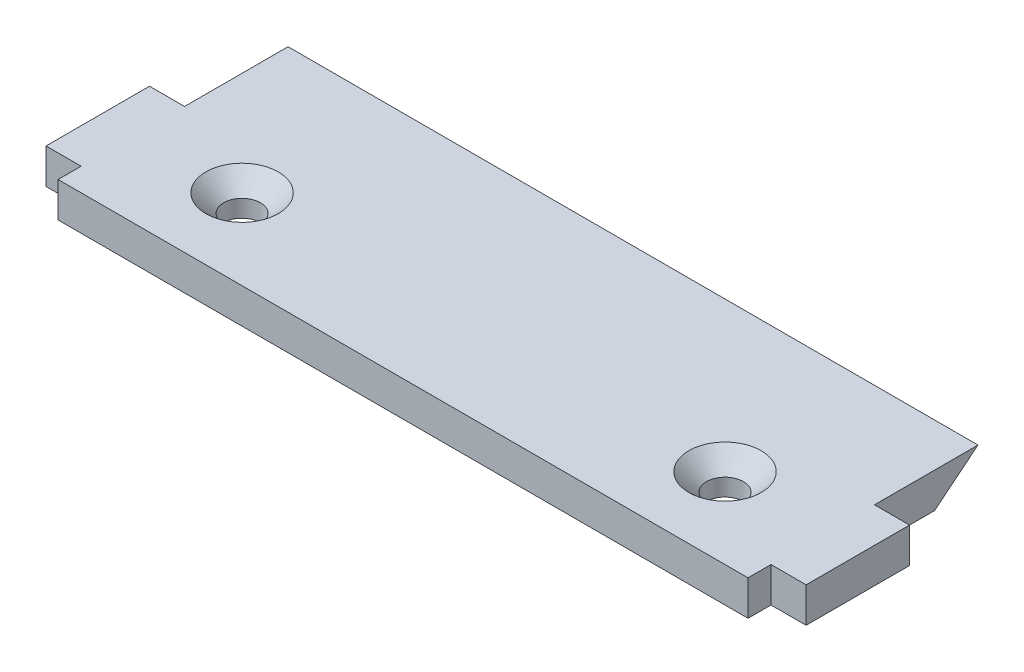
ISO-10303-21;
HEADER;
FILE_DESCRIPTION(('STEP AP214'),'2;1');
FILE_NAME('part.step','',(''),(''),'','','');
FILE_SCHEMA(('AUTOMOTIVE_DESIGN { 1 0 10303 214 1 1 1 1 }'));
ENDSEC;
DATA;
#1=APPLICATION_CONTEXT('core data for automotive mechanical design processes');
#2=APPLICATION_PROTOCOL_DEFINITION('international standard','automotive_design',2000,#1);
#3=PRODUCT_CONTEXT('',#1,'mechanical');
#4=PRODUCT('Part','Part','',(#3));
#5=PRODUCT_RELATED_PRODUCT_CATEGORY('part','',(#4));
#6=PRODUCT_DEFINITION_FORMATION('','',#4);
#7=PRODUCT_DEFINITION_CONTEXT('part definition',#1,'design');
#8=PRODUCT_DEFINITION('design','',#6,#7);
#9=PRODUCT_DEFINITION_SHAPE('','',#8);
#10=(LENGTH_UNIT() NAMED_UNIT(*) SI_UNIT(.MILLI.,.METRE.));
#11=(NAMED_UNIT(*) PLANE_ANGLE_UNIT() SI_UNIT($,.RADIAN.));
#12=(NAMED_UNIT(*) SI_UNIT($,.STERADIAN.) SOLID_ANGLE_UNIT());
#13=UNCERTAINTY_MEASURE_WITH_UNIT(LENGTH_MEASURE(1.E-05),#10,'distance_accuracy_value','');
#14=(GEOMETRIC_REPRESENTATION_CONTEXT(3) GLOBAL_UNCERTAINTY_ASSIGNED_CONTEXT((#13)) GLOBAL_UNIT_ASSIGNED_CONTEXT((#10,
#11,#12)) REPRESENTATION_CONTEXT('',''));
#15=CARTESIAN_POINT('',(0.,0.,0.));
#16=DIRECTION('',(0.,0.,1.));
#17=DIRECTION('',(1.,0.,0.));
#18=AXIS2_PLACEMENT_3D('',#15,#16,#17);
#19=CARTESIAN_POINT('',(0.,3.05,-2.));
#20=DIRECTION('',(0.,0.,1.));
#21=DIRECTION('',(1.,0.,0.));
#22=AXIS2_PLACEMENT_3D('',#19,#20,#21);
#23=PLANE('',#22);
#24=DIRECTION('',(-1.,0.,0.));
#25=VECTOR('',#24,1.);
#26=CARTESIAN_POINT('',(0.,0.,-2.));
#27=LINE('',#26,#25);
#28=CARTESIAN_POINT('',(66.1,0.,-2.));
#29=VERTEX_POINT('',#28);
#30=CARTESIAN_POINT('',(63.05,0.,-2.));
#31=VERTEX_POINT('',#30);
#32=EDGE_CURVE('E233',#29,#31,#27,.T.);
#33=ORIENTED_EDGE('',*,*,#32,.F.);
#34=DIRECTION('',(0.,-1.,0.));
#35=VECTOR('',#34,1.);
#36=CARTESIAN_POINT('',(66.1,3.05,-2.));
#37=LINE('',#36,#35);
#38=CARTESIAN_POINT('',(66.1,3.05,-2.));
#39=VERTEX_POINT('',#38);
#40=EDGE_CURVE('E55',#39,#29,#37,.T.);
#41=ORIENTED_EDGE('',*,*,#40,.F.);
#42=DIRECTION('',(-1.,0.,0.));
#43=VECTOR('',#42,1.);
#44=CARTESIAN_POINT('',(0.,3.05,-2.));
#45=LINE('',#44,#43);
#46=CARTESIAN_POINT('',(63.05,3.05,-2.));
#47=VERTEX_POINT('',#46);
#48=EDGE_CURVE('E211',#39,#47,#45,.T.);
#49=ORIENTED_EDGE('',*,*,#48,.T.);
#50=DIRECTION('',(0.,-1.,0.));
#51=VECTOR('',#50,1.);
#52=CARTESIAN_POINT('',(63.05,3.05,-2.));
#53=LINE('',#52,#51);
#54=EDGE_CURVE('E109',#47,#31,#53,.T.);
#55=ORIENTED_EDGE('',*,*,#54,.T.);
#56=EDGE_LOOP('',(#33,#41,#49,#55));
#57=FACE_BOUND('',#56,.T.);
#58=ADVANCED_FACE('F47',(#57),#23,.T.);
#59=CARTESIAN_POINT('',(66.1,3.05,0.));
#60=DIRECTION('',(-1.,0.,0.));
#61=DIRECTION('',(0.,0.,1.));
#62=AXIS2_PLACEMENT_3D('',#59,#60,#61);
#63=PLANE('',#62);
#64=DIRECTION('',(0.,0.,-1.));
#65=VECTOR('',#64,1.);
#66=CARTESIAN_POINT('',(66.1,0.,0.));
#67=LINE('',#66,#65);
#68=CARTESIAN_POINT('',(66.1,0.,-11.));
#69=VERTEX_POINT('',#68);
#70=EDGE_CURVE('E238',#29,#69,#67,.T.);
#71=ORIENTED_EDGE('',*,*,#70,.T.);
#72=DIRECTION('',(0.,-1.,0.));
#73=VECTOR('',#72,1.);
#74=CARTESIAN_POINT('',(66.1,3.05,-11.));
#75=LINE('',#74,#73);
#76=CARTESIAN_POINT('',(66.1,3.05,-11.));
#77=VERTEX_POINT('',#76);
#78=EDGE_CURVE('E297',#77,#69,#75,.T.);
#79=ORIENTED_EDGE('',*,*,#78,.F.);
#80=DIRECTION('',(0.,0.,-1.));
#81=VECTOR('',#80,1.);
#82=CARTESIAN_POINT('',(66.1,3.05,0.));
#83=LINE('',#82,#81);
#84=EDGE_CURVE('E206',#39,#77,#83,.T.);
#85=ORIENTED_EDGE('',*,*,#84,.F.);
#86=ORIENTED_EDGE('',*,*,#40,.T.);
#87=EDGE_LOOP('',(#71,#79,#85,#86));
#88=FACE_BOUND('',#87,.T.);
#89=ADVANCED_FACE('F302',(#88),#63,.F.);
#90=CARTESIAN_POINT('',(0.,3.05,-11.));
#91=DIRECTION('',(0.,0.,1.));
#92=DIRECTION('',(1.,0.,0.));
#93=AXIS2_PLACEMENT_3D('',#90,#91,#92);
#94=PLANE('',#93);
#95=DIRECTION('',(-1.,0.,0.));
#96=VECTOR('',#95,1.);
#97=CARTESIAN_POINT('',(0.,0.,-11.));
#98=LINE('',#97,#96);
#99=CARTESIAN_POINT('',(63.05,0.,-11.));
#100=VERTEX_POINT('',#99);
#101=EDGE_CURVE('E244',#69,#100,#98,.T.);
#102=ORIENTED_EDGE('',*,*,#101,.T.);
#103=DIRECTION('',(0.,-1.,0.));
#104=VECTOR('',#103,1.);
#105=CARTESIAN_POINT('',(63.05,3.05,-11.));
#106=LINE('',#105,#104);
#107=CARTESIAN_POINT('',(63.05,3.05,-11.));
#108=VERTEX_POINT('',#107);
#109=EDGE_CURVE('E293',#108,#100,#106,.T.);
#110=ORIENTED_EDGE('',*,*,#109,.F.);
#111=DIRECTION('',(-1.,0.,0.));
#112=VECTOR('',#111,1.);
#113=CARTESIAN_POINT('',(0.,3.05,-11.));
#114=LINE('',#113,#112);
#115=EDGE_CURVE('E202',#77,#108,#114,.T.);
#116=ORIENTED_EDGE('',*,*,#115,.F.);
#117=ORIENTED_EDGE('',*,*,#78,.T.);
#118=EDGE_LOOP('',(#102,#110,#116,#117));
#119=FACE_BOUND('',#118,.T.);
#120=ADVANCED_FACE('F310',(#119),#94,.F.);
#121=CARTESIAN_POINT('',(63.05,3.05,0.));
#122=DIRECTION('',(1.,0.,0.));
#123=DIRECTION('',(0.,0.,-1.));
#124=AXIS2_PLACEMENT_3D('',#121,#122,#123);
#125=PLANE('',#124);
#126=DIRECTION('',(0.,-0.628337107049704,0.777941180234347));
#127=VECTOR('',#126,1.);
#128=CARTESIAN_POINT('',(63.05,-6.72618621286564,-7.89615040191183));
#129=LINE('',#128,#127);
#130=CARTESIAN_POINT('',(63.05,3.05,-20.));
#131=VERTEX_POINT('',#130);
#132=CARTESIAN_POINT('',(63.05,0.,-16.223809523433));
#133=VERTEX_POINT('',#132);
#134=EDGE_CURVE('E62',#131,#133,#129,.T.);
#135=ORIENTED_EDGE('',*,*,#134,.F.);
#136=DIRECTION('',(0.,0.,1.));
#137=VECTOR('',#136,1.);
#138=CARTESIAN_POINT('',(63.05,3.05,0.));
#139=LINE('',#138,#137);
#140=EDGE_CURVE('E198',#131,#108,#139,.T.);
#141=ORIENTED_EDGE('',*,*,#140,.T.);
#142=ORIENTED_EDGE('',*,*,#109,.T.);
#143=DIRECTION('',(0.,0.,1.));
#144=VECTOR('',#143,1.);
#145=CARTESIAN_POINT('',(63.05,0.,0.));
#146=LINE('',#145,#144);
#147=EDGE_CURVE('E251',#133,#100,#146,.T.);
#148=ORIENTED_EDGE('',*,*,#147,.F.);
#149=EDGE_LOOP('',(#135,#141,#142,#148));
#150=FACE_BOUND('',#149,.T.);
#151=ADVANCED_FACE('F314',(#150),#125,.T.);
#152=CARTESIAN_POINT('',(3.05,3.05,0.));
#153=DIRECTION('',(1.,0.,0.));
#154=DIRECTION('',(0.,0.,-1.));
#155=AXIS2_PLACEMENT_3D('',#152,#153,#154);
#156=PLANE('',#155);
#157=DIRECTION('',(0.,0.,1.));
#158=VECTOR('',#157,1.);
#159=CARTESIAN_POINT('',(3.05,3.05,0.));
#160=LINE('',#159,#158);
#161=CARTESIAN_POINT('',(3.05,3.05,-20.));
#162=VERTEX_POINT('',#161);
#163=CARTESIAN_POINT('',(3.05,3.05,-11.));
#164=VERTEX_POINT('',#163);
#165=EDGE_CURVE('E186',#162,#164,#160,.T.);
#166=ORIENTED_EDGE('',*,*,#165,.F.);
#167=DIRECTION('',(0.,0.628337107049704,-0.777941180234347));
#168=VECTOR('',#167,1.);
#169=CARTESIAN_POINT('',(3.05,3.05,-20.));
#170=LINE('',#169,#168);
#171=CARTESIAN_POINT('',(3.05,0.,-16.223809523433));
#172=VERTEX_POINT('',#171);
#173=EDGE_CURVE('E555',#172,#162,#170,.T.);
#174=ORIENTED_EDGE('',*,*,#173,.F.);
#175=DIRECTION('',(0.,0.,1.));
#176=VECTOR('',#175,1.);
#177=CARTESIAN_POINT('',(3.05,0.,0.));
#178=LINE('',#177,#176);
#179=CARTESIAN_POINT('',(3.05,0.,-11.));
#180=VERTEX_POINT('',#179);
#181=EDGE_CURVE('E254',#172,#180,#178,.T.);
#182=ORIENTED_EDGE('',*,*,#181,.T.);
#183=DIRECTION('',(0.,-1.,0.));
#184=VECTOR('',#183,1.);
#185=CARTESIAN_POINT('',(3.05,3.05,-11.));
#186=LINE('',#185,#184);
#187=EDGE_CURVE('E289',#164,#180,#186,.T.);
#188=ORIENTED_EDGE('',*,*,#187,.F.);
#189=EDGE_LOOP('',(#166,#174,#182,#188));
#190=FACE_BOUND('',#189,.T.);
#191=ADVANCED_FACE('F320',(#190),#156,.F.);
#192=CARTESIAN_POINT('',(0.,3.05,-11.));
#193=DIRECTION('',(0.,0.,-1.));
#194=DIRECTION('',(-1.,0.,0.));
#195=AXIS2_PLACEMENT_3D('',#192,#193,#194);
#196=PLANE('',#195);
#197=DIRECTION('',(1.,0.,0.));
#198=VECTOR('',#197,1.);
#199=CARTESIAN_POINT('',(0.,0.,-11.));
#200=LINE('',#199,#198);
#201=CARTESIAN_POINT('',(0.,0.,-11.));
#202=VERTEX_POINT('',#201);
#203=EDGE_CURVE('E257',#202,#180,#200,.T.);
#204=ORIENTED_EDGE('',*,*,#203,.F.);
#205=DIRECTION('',(0.,-1.,0.));
#206=VECTOR('',#205,1.);
#207=CARTESIAN_POINT('',(0.,3.05,-11.));
#208=LINE('',#207,#206);
#209=CARTESIAN_POINT('',(0.,3.05,-11.));
#210=VERTEX_POINT('',#209);
#211=EDGE_CURVE('E286',#210,#202,#208,.T.);
#212=ORIENTED_EDGE('',*,*,#211,.F.);
#213=DIRECTION('',(1.,0.,0.));
#214=VECTOR('',#213,1.);
#215=CARTESIAN_POINT('',(0.,3.05,-11.));
#216=LINE('',#215,#214);
#217=EDGE_CURVE('E181',#210,#164,#216,.T.);
#218=ORIENTED_EDGE('',*,*,#217,.T.);
#219=ORIENTED_EDGE('',*,*,#187,.T.);
#220=EDGE_LOOP('',(#204,#212,#218,#219));
#221=FACE_BOUND('',#220,.T.);
#222=ADVANCED_FACE('F324',(#221),#196,.T.);
#223=CARTESIAN_POINT('',(0.,3.05,0.));
#224=DIRECTION('',(-1.,0.,0.));
#225=DIRECTION('',(0.,0.,1.));
#226=AXIS2_PLACEMENT_3D('',#223,#224,#225);
#227=PLANE('',#226);
#228=DIRECTION('',(0.,0.,-1.));
#229=VECTOR('',#228,1.);
#230=CARTESIAN_POINT('',(0.,0.,0.));
#231=LINE('',#230,#229);
#232=CARTESIAN_POINT('',(0.,0.,-2.));
#233=VERTEX_POINT('',#232);
#234=EDGE_CURVE('E261',#233,#202,#231,.T.);
#235=ORIENTED_EDGE('',*,*,#234,.F.);
#236=DIRECTION('',(0.,-1.,0.));
#237=VECTOR('',#236,1.);
#238=CARTESIAN_POINT('',(0.,3.05,-2.));
#239=LINE('',#238,#237);
#240=CARTESIAN_POINT('',(0.,3.05,-2.));
#241=VERTEX_POINT('',#240);
#242=EDGE_CURVE('E283',#241,#233,#239,.T.);
#243=ORIENTED_EDGE('',*,*,#242,.F.);
#244=DIRECTION('',(0.,0.,-1.));
#245=VECTOR('',#244,1.);
#246=CARTESIAN_POINT('',(0.,3.05,0.));
#247=LINE('',#246,#245);
#248=EDGE_CURVE('E166',#241,#210,#247,.T.);
#249=ORIENTED_EDGE('',*,*,#248,.T.);
#250=ORIENTED_EDGE('',*,*,#211,.T.);
#251=EDGE_LOOP('',(#235,#243,#249,#250));
#252=FACE_BOUND('',#251,.T.);
#253=ADVANCED_FACE('F328',(#252),#227,.T.);
#254=CARTESIAN_POINT('',(0.,3.05,-2.));
#255=DIRECTION('',(0.,0.,-1.));
#256=DIRECTION('',(-1.,0.,0.));
#257=AXIS2_PLACEMENT_3D('',#254,#255,#256);
#258=PLANE('',#257);
#259=DIRECTION('',(1.,0.,0.));
#260=VECTOR('',#259,1.);
#261=CARTESIAN_POINT('',(0.,0.,-2.));
#262=LINE('',#261,#260);
#263=CARTESIAN_POINT('',(3.05,0.,-2.));
#264=VERTEX_POINT('',#263);
#265=EDGE_CURVE('E265',#233,#264,#262,.T.);
#266=ORIENTED_EDGE('',*,*,#265,.T.);
#267=DIRECTION('',(0.,-1.,0.));
#268=VECTOR('',#267,1.);
#269=CARTESIAN_POINT('',(3.05,3.05,-2.));
#270=LINE('',#269,#268);
#271=CARTESIAN_POINT('',(3.05,3.05,-2.));
#272=VERTEX_POINT('',#271);
#273=EDGE_CURVE('E149',#272,#264,#270,.T.);
#274=ORIENTED_EDGE('',*,*,#273,.F.);
#275=DIRECTION('',(1.,0.,0.));
#276=VECTOR('',#275,1.);
#277=CARTESIAN_POINT('',(0.,3.05,-2.));
#278=LINE('',#277,#276);
#279=EDGE_CURVE('E161',#241,#272,#278,.T.);
#280=ORIENTED_EDGE('',*,*,#279,.F.);
#281=ORIENTED_EDGE('',*,*,#242,.T.);
#282=EDGE_LOOP('',(#266,#274,#280,#281));
#283=FACE_BOUND('',#282,.T.);
#284=ADVANCED_FACE('F332',(#283),#258,.F.);
#285=CARTESIAN_POINT('',(3.05,3.05,0.));
#286=DIRECTION('',(-1.,0.,0.));
#287=DIRECTION('',(0.,0.,1.));
#288=AXIS2_PLACEMENT_3D('',#285,#286,#287);
#289=PLANE('',#288);
#290=DIRECTION('',(0.,0.,-1.));
#291=VECTOR('',#290,1.);
#292=CARTESIAN_POINT('',(3.05,0.,0.));
#293=LINE('',#292,#291);
#294=CARTESIAN_POINT('',(3.05,0.,0.));
#295=VERTEX_POINT('',#294);
#296=EDGE_CURVE('E144',#295,#264,#293,.T.);
#297=ORIENTED_EDGE('',*,*,#296,.F.);
#298=DIRECTION('',(0.,-1.,0.));
#299=VECTOR('',#298,1.);
#300=CARTESIAN_POINT('',(3.05,3.05,0.));
#301=LINE('',#300,#299);
#302=CARTESIAN_POINT('',(3.05,3.05,0.));
#303=VERTEX_POINT('',#302);
#304=EDGE_CURVE('E138',#303,#295,#301,.T.);
#305=ORIENTED_EDGE('',*,*,#304,.F.);
#306=DIRECTION('',(0.,0.,-1.));
#307=VECTOR('',#306,1.);
#308=CARTESIAN_POINT('',(3.05,3.05,0.));
#309=LINE('',#308,#307);
#310=EDGE_CURVE('E142',#303,#272,#309,.T.);
#311=ORIENTED_EDGE('',*,*,#310,.T.);
#312=ORIENTED_EDGE('',*,*,#273,.T.);
#313=EDGE_LOOP('',(#297,#305,#311,#312));
#314=FACE_BOUND('',#313,.T.);
#315=ADVANCED_FACE('F140',(#314),#289,.T.);
#316=CARTESIAN_POINT('',(0.,3.05,0.));
#317=DIRECTION('',(0.,0.,-1.));
#318=DIRECTION('',(-1.,0.,0.));
#319=AXIS2_PLACEMENT_3D('',#316,#317,#318);
#320=PLANE('',#319);
#321=DIRECTION('',(1.,0.,0.));
#322=VECTOR('',#321,1.);
#323=CARTESIAN_POINT('',(0.,0.,0.));
#324=LINE('',#323,#322);
#325=CARTESIAN_POINT('',(63.05,0.,0.));
#326=VERTEX_POINT('',#325);
#327=EDGE_CURVE('E271',#295,#326,#324,.T.);
#328=ORIENTED_EDGE('',*,*,#327,.T.);
#329=DIRECTION('',(0.,-1.,0.));
#330=VECTOR('',#329,1.);
#331=CARTESIAN_POINT('',(63.05,3.05,0.));
#332=LINE('',#331,#330);
#333=CARTESIAN_POINT('',(63.05,3.05,0.));
#334=VERTEX_POINT('',#333);
#335=EDGE_CURVE('E150',#334,#326,#332,.T.);
#336=ORIENTED_EDGE('',*,*,#335,.F.);
#337=DIRECTION('',(1.,0.,0.));
#338=VECTOR('',#337,1.);
#339=CARTESIAN_POINT('',(0.,3.05,0.));
#340=LINE('',#339,#338);
#341=EDGE_CURVE('E153',#303,#334,#340,.T.);
#342=ORIENTED_EDGE('',*,*,#341,.F.);
#343=ORIENTED_EDGE('',*,*,#304,.T.);
#344=EDGE_LOOP('',(#328,#336,#342,#343));
#345=FACE_BOUND('',#344,.T.);
#346=ADVANCED_FACE('F154',(#345),#320,.F.);
#347=CARTESIAN_POINT('',(63.05,3.05,0.));
#348=DIRECTION('',(-1.,0.,0.));
#349=DIRECTION('',(0.,0.,1.));
#350=AXIS2_PLACEMENT_3D('',#347,#348,#349);
#351=PLANE('',#350);
#352=DIRECTION('',(0.,0.,-1.));
#353=VECTOR('',#352,1.);
#354=CARTESIAN_POINT('',(63.05,0.,0.));
#355=LINE('',#354,#353);
#356=EDGE_CURVE('E274',#326,#31,#355,.T.);
#357=ORIENTED_EDGE('',*,*,#356,.T.);
#358=ORIENTED_EDGE('',*,*,#54,.F.);
#359=DIRECTION('',(0.,0.,-1.));
#360=VECTOR('',#359,1.);
#361=CARTESIAN_POINT('',(63.05,3.05,0.));
#362=LINE('',#361,#360);
#363=EDGE_CURVE('E70',#334,#47,#362,.T.);
#364=ORIENTED_EDGE('',*,*,#363,.F.);
#365=ORIENTED_EDGE('',*,*,#335,.T.);
#366=EDGE_LOOP('',(#357,#358,#364,#365));
#367=FACE_BOUND('',#366,.T.);
#368=ADVANCED_FACE('F341',(#367),#351,.F.);
#369=CARTESIAN_POINT('',(0.,3.05,0.));
#370=DIRECTION('',(0.,1.,0.));
#371=DIRECTION('',(0.,0.,1.));
#372=AXIS2_PLACEMENT_3D('',#369,#370,#371);
#373=PLANE('',#372);
#374=CARTESIAN_POINT('',(54.05,3.05,-7.));
#375=DIRECTION('',(0.,1.,0.));
#376=DIRECTION('',(0.,0.,1.));
#377=AXIS2_PLACEMENT_3D('',#374,#375,#376);
#378=CIRCLE('',#377,3.15);
#379=CARTESIAN_POINT('',(54.05,3.05,-3.85));
#380=VERTEX_POINT('',#379);
#381=EDGE_CURVE('E551',#380,#380,#378,.T.);
#382=ORIENTED_EDGE('',*,*,#381,.F.);
#383=EDGE_LOOP('',(#382));
#384=FACE_BOUND('',#383,.T.);
#385=CARTESIAN_POINT('',(12.05,3.05,-7.));
#386=DIRECTION('',(0.,1.,0.));
#387=DIRECTION('',(0.,0.,1.));
#388=AXIS2_PLACEMENT_3D('',#385,#386,#387);
#389=CIRCLE('',#388,3.15);
#390=CARTESIAN_POINT('',(12.05,3.05,-3.85));
#391=VERTEX_POINT('',#390);
#392=EDGE_CURVE('E219',#391,#391,#389,.T.);
#393=ORIENTED_EDGE('',*,*,#392,.F.);
#394=EDGE_LOOP('',(#393));
#395=FACE_BOUND('',#394,.T.);
#396=ORIENTED_EDGE('',*,*,#48,.F.);
#397=ORIENTED_EDGE('',*,*,#84,.T.);
#398=ORIENTED_EDGE('',*,*,#115,.T.);
#399=ORIENTED_EDGE('',*,*,#140,.F.);
#400=DIRECTION('',(1.,0.,0.));
#401=VECTOR('',#400,1.);
#402=CARTESIAN_POINT('',(0.,3.05,-20.));
#403=LINE('',#402,#401);
#404=EDGE_CURVE('E190',#162,#131,#403,.T.);
#405=ORIENTED_EDGE('',*,*,#404,.F.);
#406=ORIENTED_EDGE('',*,*,#165,.T.);
#407=ORIENTED_EDGE('',*,*,#217,.F.);
#408=ORIENTED_EDGE('',*,*,#248,.F.);
#409=ORIENTED_EDGE('',*,*,#279,.T.);
#410=ORIENTED_EDGE('',*,*,#310,.F.);
#411=ORIENTED_EDGE('',*,*,#341,.T.);
#412=ORIENTED_EDGE('',*,*,#363,.T.);
#413=EDGE_LOOP('',(#396,#397,#398,#399,#405,#406,#407,#408,#409,#410,#411,#412));
#414=FACE_BOUND('',#413,.T.);
#415=ADVANCED_FACE('F158',(#384,#395,#414),#373,.T.);
#416=CARTESIAN_POINT('',(0.,0.,0.));
#417=DIRECTION('',(0.,1.,0.));
#418=DIRECTION('',(0.,0.,1.));
#419=AXIS2_PLACEMENT_3D('',#416,#417,#418);
#420=PLANE('',#419);
#421=CARTESIAN_POINT('',(54.05,0.,-7.));
#422=DIRECTION('',(0.,1.,0.));
#423=DIRECTION('',(0.,0.,1.));
#424=AXIS2_PLACEMENT_3D('',#421,#422,#423);
#425=CIRCLE('',#424,1.6);
#426=CARTESIAN_POINT('',(54.05,0.,-5.4));
#427=VERTEX_POINT('',#426);
#428=EDGE_CURVE('E226',#427,#427,#425,.T.);
#429=ORIENTED_EDGE('',*,*,#428,.T.);
#430=EDGE_LOOP('',(#429));
#431=FACE_BOUND('',#430,.T.);
#432=CARTESIAN_POINT('',(12.05,0.,-7.));
#433=DIRECTION('',(0.,1.,0.));
#434=DIRECTION('',(0.,0.,1.));
#435=AXIS2_PLACEMENT_3D('',#432,#433,#434);
#436=CIRCLE('',#435,1.6);
#437=CARTESIAN_POINT('',(12.05,0.,-5.4));
#438=VERTEX_POINT('',#437);
#439=EDGE_CURVE('E230',#438,#438,#436,.T.);
#440=ORIENTED_EDGE('',*,*,#439,.T.);
#441=EDGE_LOOP('',(#440));
#442=FACE_BOUND('',#441,.T.);
#443=ORIENTED_EDGE('',*,*,#181,.F.);
#444=DIRECTION('',(1.,0.,0.));
#445=VECTOR('',#444,1.);
#446=CARTESIAN_POINT('',(0.,0.,-16.223809523433));
#447=LINE('',#446,#445);
#448=EDGE_CURVE('E12',#172,#133,#447,.T.);
#449=ORIENTED_EDGE('',*,*,#448,.T.);
#450=ORIENTED_EDGE('',*,*,#147,.T.);
#451=ORIENTED_EDGE('',*,*,#101,.F.);
#452=ORIENTED_EDGE('',*,*,#70,.F.);
#453=ORIENTED_EDGE('',*,*,#32,.T.);
#454=ORIENTED_EDGE('',*,*,#356,.F.);
#455=ORIENTED_EDGE('',*,*,#327,.F.);
#456=ORIENTED_EDGE('',*,*,#296,.T.);
#457=ORIENTED_EDGE('',*,*,#265,.F.);
#458=ORIENTED_EDGE('',*,*,#234,.T.);
#459=ORIENTED_EDGE('',*,*,#203,.T.);
#460=EDGE_LOOP('',(#443,#449,#450,#451,#452,#453,#454,#455,#456,#457,#458,#459));
#461=FACE_BOUND('',#460,.T.);
#462=ADVANCED_FACE('F305',(#431,#442,#461),#420,.F.);
#463=CARTESIAN_POINT('',(12.05,3.05,-7.));
#464=DIRECTION('',(0.,1.,0.));
#465=DIRECTION('',(0.,0.,1.));
#466=AXIS2_PLACEMENT_3D('',#463,#464,#465);
#467=CYLINDRICAL_SURFACE('',#466,1.6);
#468=ORIENTED_EDGE('',*,*,#439,.F.);
#469=EDGE_LOOP('',(#468));
#470=FACE_BOUND('',#469,.T.);
#471=CARTESIAN_POINT('',(12.05,1.5,-7.));
#472=DIRECTION('',(0.,1.,0.));
#473=DIRECTION('',(0.,0.,1.));
#474=AXIS2_PLACEMENT_3D('',#471,#472,#473);
#475=CIRCLE('',#474,1.6);
#476=CARTESIAN_POINT('',(12.05,1.5,-5.4));
#477=VERTEX_POINT('',#476);
#478=EDGE_CURVE('E225',#477,#477,#475,.T.);
#479=ORIENTED_EDGE('',*,*,#478,.T.);
#480=EDGE_LOOP('',(#479));
#481=FACE_BOUND('',#480,.T.);
#482=ADVANCED_FACE('F347',(#470,#481),#467,.F.);
#483=CARTESIAN_POINT('',(12.05,3.05,-7.));
#484=DIRECTION('',(0.,1.,0.));
#485=DIRECTION('',(0.,0.,1.));
#486=AXIS2_PLACEMENT_3D('',#483,#484,#485);
#487=CONICAL_SURFACE('',#486,3.15,0.785398163397449);
#488=ORIENTED_EDGE('',*,*,#478,.F.);
#489=EDGE_LOOP('',(#488));
#490=FACE_BOUND('',#489,.T.);
#491=ORIENTED_EDGE('',*,*,#392,.T.);
#492=EDGE_LOOP('',(#491));
#493=FACE_BOUND('',#492,.T.);
#494=ADVANCED_FACE('F354',(#490,#493),#487,.F.);
#495=CARTESIAN_POINT('',(54.05,3.05,-7.));
#496=DIRECTION('',(0.,1.,0.));
#497=DIRECTION('',(0.,0.,1.));
#498=AXIS2_PLACEMENT_3D('',#495,#496,#497);
#499=CYLINDRICAL_SURFACE('',#498,1.6);
#500=ORIENTED_EDGE('',*,*,#428,.F.);
#501=EDGE_LOOP('',(#500));
#502=FACE_BOUND('',#501,.T.);
#503=CARTESIAN_POINT('',(54.05,1.5,-7.));
#504=DIRECTION('',(0.,1.,0.));
#505=DIRECTION('',(0.,0.,1.));
#506=AXIS2_PLACEMENT_3D('',#503,#504,#505);
#507=CIRCLE('',#506,1.6);
#508=CARTESIAN_POINT('',(54.05,1.5,-5.4));
#509=VERTEX_POINT('',#508);
#510=EDGE_CURVE('E548',#509,#509,#507,.T.);
#511=ORIENTED_EDGE('',*,*,#510,.T.);
#512=EDGE_LOOP('',(#511));
#513=FACE_BOUND('',#512,.T.);
#514=ADVANCED_FACE('F358',(#502,#513),#499,.F.);
#515=CARTESIAN_POINT('',(54.05,3.05,-7.));
#516=DIRECTION('',(0.,1.,0.));
#517=DIRECTION('',(0.,0.,1.));
#518=AXIS2_PLACEMENT_3D('',#515,#516,#517);
#519=CONICAL_SURFACE('',#518,3.15,0.785398163397449);
#520=ORIENTED_EDGE('',*,*,#510,.F.);
#521=EDGE_LOOP('',(#520));
#522=FACE_BOUND('',#521,.T.);
#523=ORIENTED_EDGE('',*,*,#381,.T.);
#524=EDGE_LOOP('',(#523));
#525=FACE_BOUND('',#524,.T.);
#526=ADVANCED_FACE('F362',(#522,#525),#519,.F.);
#527=CARTESIAN_POINT('',(66.1,3.05,-20.));
#528=DIRECTION('',(0.,0.777941180234347,0.628337107049704));
#529=DIRECTION('',(0.,-0.628337107049704,0.777941180234347));
#530=AXIS2_PLACEMENT_3D('',#527,#528,#529);
#531=PLANE('',#530);
#532=ORIENTED_EDGE('',*,*,#134,.T.);
#533=ORIENTED_EDGE('',*,*,#448,.F.);
#534=ORIENTED_EDGE('',*,*,#173,.T.);
#535=ORIENTED_EDGE('',*,*,#404,.T.);
#536=EDGE_LOOP('',(#532,#533,#534,#535));
#537=FACE_BOUND('',#536,.T.);
#538=ADVANCED_FACE('F366',(#537),#531,.F.);
#539=CLOSED_SHELL('',(#58,#89,#120,#151,#191,#222,#253,#284,#315,#346,#368,#415,#462,#482,#494,
#514,#526,#538));
#540=MANIFOLD_SOLID_BREP('B2',#539);
#541=ADVANCED_BREP_SHAPE_REPRESENTATION('',(#18,#540),#14);
#542=SHAPE_DEFINITION_REPRESENTATION(#9,#541);
ENDSEC;
END-ISO-10303-21;
